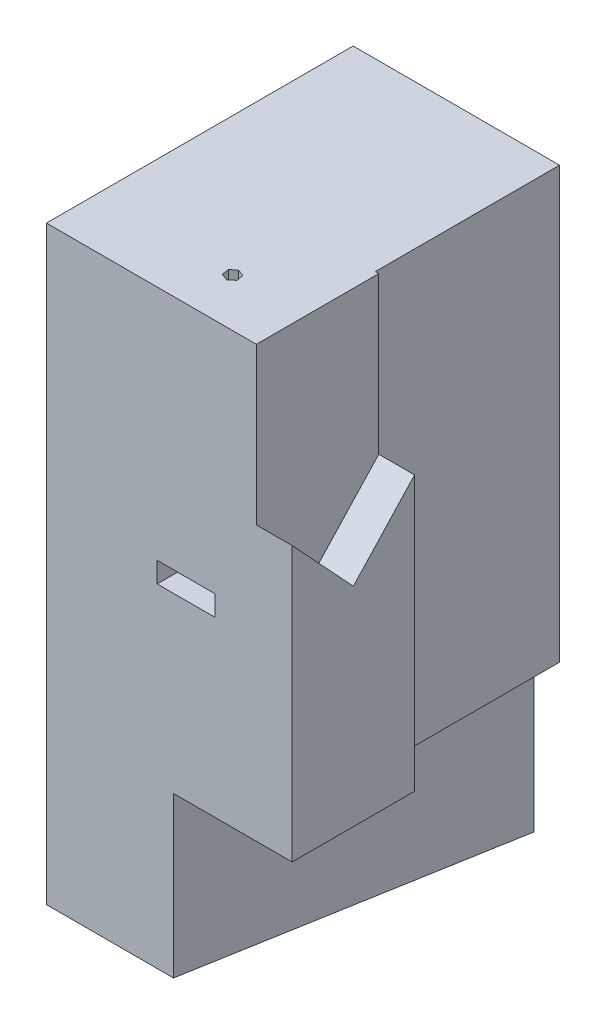
ISO-10303-21;
HEADER;
FILE_DESCRIPTION(('STEP AP214'),'2;1');
FILE_NAME('part.step','',(''),(''),'','','');
FILE_SCHEMA(('AUTOMOTIVE_DESIGN { 1 0 10303 214 1 1 1 1 }'));
ENDSEC;
DATA;
#1=APPLICATION_CONTEXT('core data for automotive mechanical design processes');
#2=APPLICATION_PROTOCOL_DEFINITION('international standard','automotive_design',2000,#1);
#3=PRODUCT_CONTEXT('',#1,'mechanical');
#4=PRODUCT('Part','Part','',(#3));
#5=PRODUCT_RELATED_PRODUCT_CATEGORY('part','',(#4));
#6=PRODUCT_DEFINITION_FORMATION('','',#4);
#7=PRODUCT_DEFINITION_CONTEXT('part definition',#1,'design');
#8=PRODUCT_DEFINITION('design','',#6,#7);
#9=PRODUCT_DEFINITION_SHAPE('','',#8);
#10=(LENGTH_UNIT() NAMED_UNIT(*) SI_UNIT(.MILLI.,.METRE.));
#11=(NAMED_UNIT(*) PLANE_ANGLE_UNIT() SI_UNIT($,.RADIAN.));
#12=(NAMED_UNIT(*) SI_UNIT($,.STERADIAN.) SOLID_ANGLE_UNIT());
#13=UNCERTAINTY_MEASURE_WITH_UNIT(LENGTH_MEASURE(1.E-05),#10,'distance_accuracy_value','');
#14=(GEOMETRIC_REPRESENTATION_CONTEXT(3) GLOBAL_UNCERTAINTY_ASSIGNED_CONTEXT((#13)) GLOBAL_UNIT_ASSIGNED_CONTEXT((#10,
#11,#12)) REPRESENTATION_CONTEXT('',''));
#15=CARTESIAN_POINT('',(0.,0.,0.));
#16=DIRECTION('',(0.,0.,1.));
#17=DIRECTION('',(1.,0.,0.));
#18=AXIS2_PLACEMENT_3D('',#15,#16,#17);
#19=CARTESIAN_POINT('',(0.,0.,0.));
#20=DIRECTION('',(1.,0.,0.));
#21=DIRECTION('',(0.,1.,0.));
#22=AXIS2_PLACEMENT_3D('',#19,#20,#21);
#23=PLANE('',#22);
#24=DIRECTION('',(0.,1.,0.));
#25=VECTOR('',#24,1.);
#26=CARTESIAN_POINT('',(0.,0.,42.183824742807));
#27=LINE('',#26,#25);
#28=CARTESIAN_POINT('',(0.,0.,42.183824742807));
#29=VERTEX_POINT('',#28);
#30=CARTESIAN_POINT('',(0.,81.175967861416,42.183824742807));
#31=VERTEX_POINT('',#30);
#32=EDGE_CURVE('E46',#29,#31,#27,.T.);
#33=ORIENTED_EDGE('',*,*,#32,.T.);
#34=DIRECTION('',(0.,0.,1.));
#35=VECTOR('',#34,1.);
#36=CARTESIAN_POINT('',(0.,81.175967861416,0.));
#37=LINE('',#36,#35);
#38=CARTESIAN_POINT('',(0.,81.175967861416,0.));
#39=VERTEX_POINT('',#38);
#40=EDGE_CURVE('E197',#39,#31,#37,.T.);
#41=ORIENTED_EDGE('',*,*,#40,.F.);
#42=DIRECTION('',(0.,1.,0.));
#43=VECTOR('',#42,1.);
#44=CARTESIAN_POINT('',(0.,0.,0.));
#45=LINE('',#44,#43);
#46=CARTESIAN_POINT('',(0.,0.,0.));
#47=VERTEX_POINT('',#46);
#48=EDGE_CURVE('E195',#47,#39,#45,.T.);
#49=ORIENTED_EDGE('',*,*,#48,.F.);
#50=DIRECTION('',(0.,0.,1.));
#51=VECTOR('',#50,1.);
#52=CARTESIAN_POINT('',(0.,0.,0.));
#53=LINE('',#52,#51);
#54=EDGE_CURVE('E10',#47,#29,#53,.T.);
#55=ORIENTED_EDGE('',*,*,#54,.T.);
#56=EDGE_LOOP('',(#33,#41,#49,#55));
#57=FACE_BOUND('',#56,.T.);
#58=ADVANCED_FACE('F16',(#57),#23,.F.);
#59=CARTESIAN_POINT('',(0.,0.,0.));
#60=DIRECTION('',(0.,1.,0.));
#61=DIRECTION('',(1.,0.,0.));
#62=AXIS2_PLACEMENT_3D('',#59,#60,#61);
#63=PLANE('',#62);
#64=DIRECTION('',(0.172664554892018,0.,-0.984980685843099));
#65=VECTOR('',#64,1.);
#66=CARTESIAN_POINT('',(17.477008117361,0.,42.183824742807));
#67=LINE('',#66,#65);
#68=CARTESIAN_POINT('',(17.477008117361,0.,42.183824742807));
#69=VERTEX_POINT('',#68);
#70=CARTESIAN_POINT('',(24.871722985947,0.,0.));
#71=VERTEX_POINT('',#70);
#72=EDGE_CURVE('E217',#69,#71,#67,.T.);
#73=ORIENTED_EDGE('',*,*,#72,.F.);
#74=DIRECTION('',(1.,0.,0.));
#75=VECTOR('',#74,1.);
#76=CARTESIAN_POINT('',(0.,0.,42.183824742807));
#77=LINE('',#76,#75);
#78=EDGE_CURVE('E24',#29,#69,#77,.T.);
#79=ORIENTED_EDGE('',*,*,#78,.F.);
#80=ORIENTED_EDGE('',*,*,#54,.F.);
#81=DIRECTION('',(1.,0.,0.));
#82=VECTOR('',#81,1.);
#83=CARTESIAN_POINT('',(0.,0.,0.));
#84=LINE('',#83,#82);
#85=EDGE_CURVE('E192',#47,#71,#84,.T.);
#86=ORIENTED_EDGE('',*,*,#85,.T.);
#87=EDGE_LOOP('',(#73,#79,#80,#86));
#88=FACE_BOUND('',#87,.T.);
#89=ADVANCED_FACE('F190',(#88),#63,.F.);
#90=CARTESIAN_POINT('',(0.,0.,42.183824742807));
#91=DIRECTION('',(0.,0.,1.));
#92=DIRECTION('',(1.,0.,0.));
#93=AXIS2_PLACEMENT_3D('',#90,#91,#92);
#94=PLANE('',#93);
#95=DIRECTION('',(0.,-1.,0.));
#96=VECTOR('',#95,1.);
#97=CARTESIAN_POINT('',(15.229602048804,48.619948858316,42.183824742807));
#98=LINE('',#97,#96);
#99=CARTESIAN_POINT('',(15.229602048804,48.619948858316,42.183824742807));
#100=VERTEX_POINT('',#99);
#101=CARTESIAN_POINT('',(15.229602048804,45.812590166775,42.183824742807));
#102=VERTEX_POINT('',#101);
#103=EDGE_CURVE('E284',#100,#102,#98,.T.);
#104=ORIENTED_EDGE('',*,*,#103,.F.);
#105=DIRECTION('',(-1.,0.,0.));
#106=VECTOR('',#105,1.);
#107=CARTESIAN_POINT('',(23.152847127791,48.619948858316,42.183824742807));
#108=LINE('',#107,#106);
#109=CARTESIAN_POINT('',(23.152847127791,48.619948858316,42.183824742807));
#110=VERTEX_POINT('',#109);
#111=EDGE_CURVE('E307',#110,#100,#108,.T.);
#112=ORIENTED_EDGE('',*,*,#111,.F.);
#113=DIRECTION('',(0.,1.,0.));
#114=VECTOR('',#113,1.);
#115=CARTESIAN_POINT('',(23.152847127791,45.812590166775,42.183824742807));
#116=LINE('',#115,#114);
#117=CARTESIAN_POINT('',(23.152847127791,45.812590166775,42.183824742807));
#118=VERTEX_POINT('',#117);
#119=EDGE_CURVE('E297',#118,#110,#116,.T.);
#120=ORIENTED_EDGE('',*,*,#119,.F.);
#121=DIRECTION('',(1.,0.,0.));
#122=VECTOR('',#121,1.);
#123=CARTESIAN_POINT('',(15.229602048804,45.812590166775,42.183824742807));
#124=LINE('',#123,#122);
#125=EDGE_CURVE('E290',#102,#118,#124,.T.);
#126=ORIENTED_EDGE('',*,*,#125,.F.);
#127=EDGE_LOOP('',(#104,#112,#120,#126));
#128=FACE_BOUND('',#127,.T.);
#129=DIRECTION('',(1.,0.,0.));
#130=VECTOR('',#129,1.);
#131=CARTESIAN_POINT('',(0.,81.175967861416,42.183824742807));
#132=LINE('',#131,#130);
#133=CARTESIAN_POINT('',(28.871427412026,81.175967861416,42.183824742807));
#134=VERTEX_POINT('',#133);
#135=EDGE_CURVE('E224',#31,#134,#132,.T.);
#136=ORIENTED_EDGE('',*,*,#135,.F.);
#137=ORIENTED_EDGE('',*,*,#32,.F.);
#138=ORIENTED_EDGE('',*,*,#78,.T.);
#139=DIRECTION('',(0.,1.,0.));
#140=VECTOR('',#139,1.);
#141=CARTESIAN_POINT('',(17.477008117361,0.,42.183824742807));
#142=LINE('',#141,#140);
#143=CARTESIAN_POINT('',(17.477008117361,21.978345845395,42.183824742807));
#144=VERTEX_POINT('',#143);
#145=EDGE_CURVE('E209',#69,#144,#142,.T.);
#146=ORIENTED_EDGE('',*,*,#145,.T.);
#147=DIRECTION('',(-1.,0.,0.));
#148=VECTOR('',#147,1.);
#149=CARTESIAN_POINT('',(33.795977035529,21.978345845395,42.183824742807));
#150=LINE('',#149,#148);
#151=CARTESIAN_POINT('',(33.795977035529,21.978345845395,42.183824742807));
#152=VERTEX_POINT('',#151);
#153=EDGE_CURVE('E272',#152,#144,#150,.T.);
#154=ORIENTED_EDGE('',*,*,#153,.F.);
#155=DIRECTION('',(0.,1.,0.));
#156=VECTOR('',#155,1.);
#157=CARTESIAN_POINT('',(33.795977035529,0.,42.183824742807));
#158=LINE('',#157,#156);
#159=CARTESIAN_POINT('',(33.795977035529,59.664036571161,42.183824742807));
#160=VERTEX_POINT('',#159);
#161=EDGE_CURVE('E264',#152,#160,#158,.T.);
#162=ORIENTED_EDGE('',*,*,#161,.T.);
#163=DIRECTION('',(-1.,0.,0.));
#164=VECTOR('',#163,1.);
#165=CARTESIAN_POINT('',(33.795977035529,59.664036571161,42.183824742807));
#166=LINE('',#165,#164);
#167=CARTESIAN_POINT('',(28.871427412026,59.664036571161,42.183824742807));
#168=VERTEX_POINT('',#167);
#169=EDGE_CURVE('E256',#160,#168,#166,.T.);
#170=ORIENTED_EDGE('',*,*,#169,.T.);
#171=DIRECTION('',(0.,-1.,0.));
#172=VECTOR('',#171,1.);
#173=CARTESIAN_POINT('',(28.871427412026,81.175967861416,42.183824742807));
#174=LINE('',#173,#172);
#175=EDGE_CURVE('E242',#134,#168,#174,.T.);
#176=ORIENTED_EDGE('',*,*,#175,.F.);
#177=EDGE_LOOP('',(#136,#137,#138,#146,#154,#162,#170,#176));
#178=FACE_BOUND('',#177,.T.);
#179=ADVANCED_FACE('F233',(#128,#178),#94,.T.);
#180=CARTESIAN_POINT('',(0.,81.175967861416,0.));
#181=DIRECTION('',(0.,1.,0.));
#182=DIRECTION('',(1.,0.,0.));
#183=AXIS2_PLACEMENT_3D('',#180,#181,#182);
#184=PLANE('',#183);
#185=DIRECTION('',(0.773795954502681,0.,-0.633434938091739));
#186=VECTOR('',#185,1.);
#187=CARTESIAN_POINT('',(19.135894746739,81.175967861416,36.54601650734));
#188=LINE('',#187,#186);
#189=CARTESIAN_POINT('',(19.135894746739,81.175967861416,36.54601650734));
#190=VERTEX_POINT('',#189);
#191=CARTESIAN_POINT('',(19.909690701242,81.175967861416,35.912581569248));
#192=VERTEX_POINT('',#191);
#193=EDGE_CURVE('E351',#190,#192,#188,.T.);
#194=ORIENTED_EDGE('',*,*,#193,.F.);
#195=DIRECTION('',(0.935468725283385,0.,0.353409484899145));
#196=VECTOR('',#195,1.);
#197=CARTESIAN_POINT('',(18.200426021455,81.175967861416,36.19260702244));
#198=LINE('',#197,#196);
#199=CARTESIAN_POINT('',(18.200426021455,81.175967861416,36.19260702244));
#200=VERTEX_POINT('',#199);
#201=EDGE_CURVE('E380',#200,#190,#198,.T.);
#202=ORIENTED_EDGE('',*,*,#201,.F.);
#203=DIRECTION('',(0.161672770780964,0.,0.98684442299078));
#204=VECTOR('',#203,1.);
#205=CARTESIAN_POINT('',(18.038753250675,81.175967861416,35.205762599449));
#206=LINE('',#205,#204);
#207=CARTESIAN_POINT('',(18.038753250675,81.175967861416,35.205762599449));
#208=VERTEX_POINT('',#207);
#209=EDGE_CURVE('E371',#208,#200,#206,.T.);
#210=ORIENTED_EDGE('',*,*,#209,.F.);
#211=DIRECTION('',(-0.773795954502681,0.,0.633434938091739));
#212=VECTOR('',#211,1.);
#213=CARTESIAN_POINT('',(18.812549205178,81.175967861416,34.572327661358));
#214=LINE('',#213,#212);
#215=CARTESIAN_POINT('',(18.812549205178,81.175967861416,34.572327661358));
#216=VERTEX_POINT('',#215);
#217=EDGE_CURVE('E365',#216,#208,#214,.T.);
#218=ORIENTED_EDGE('',*,*,#217,.F.);
#219=DIRECTION('',(-0.935468725283385,0.,-0.353409484899145));
#220=VECTOR('',#219,1.);
#221=CARTESIAN_POINT('',(19.748017930461,81.175967861416,34.925737146257));
#222=LINE('',#221,#220);
#223=CARTESIAN_POINT('',(19.748017930461,81.175967861416,34.925737146257));
#224=VERTEX_POINT('',#223);
#225=EDGE_CURVE('E359',#224,#216,#222,.T.);
#226=ORIENTED_EDGE('',*,*,#225,.F.);
#227=DIRECTION('',(-0.161672770780964,0.,-0.98684442299078));
#228=VECTOR('',#227,1.);
#229=CARTESIAN_POINT('',(19.909690701242,81.175967861416,35.912581569248));
#230=LINE('',#229,#228);
#231=EDGE_CURVE('E355',#192,#224,#230,.T.);
#232=ORIENTED_EDGE('',*,*,#231,.F.);
#233=EDGE_LOOP('',(#194,#202,#210,#218,#226,#232));
#234=FACE_BOUND('',#233,.T.);
#235=DIRECTION('',(1.,0.,0.));
#236=VECTOR('',#235,1.);
#237=CARTESIAN_POINT('',(0.,81.175967861416,0.));
#238=LINE('',#237,#236);
#239=CARTESIAN_POINT('',(28.391305665756,81.175967861416,0.));
#240=VERTEX_POINT('',#239);
#241=EDGE_CURVE('E201',#39,#240,#238,.T.);
#242=ORIENTED_EDGE('',*,*,#241,.F.);
#243=ORIENTED_EDGE('',*,*,#40,.T.);
#244=ORIENTED_EDGE('',*,*,#135,.T.);
#245=DIRECTION('',(0.,0.,1.));
#246=VECTOR('',#245,1.);
#247=CARTESIAN_POINT('',(28.871427412026,81.175967861416,25.350509369454));
#248=LINE('',#247,#246);
#249=CARTESIAN_POINT('',(28.871427412026,81.175967861416,25.350509369454));
#250=VERTEX_POINT('',#249);
#251=EDGE_CURVE('E248',#250,#134,#248,.T.);
#252=ORIENTED_EDGE('',*,*,#251,.F.);
#253=DIRECTION('',(-1.,0.,0.));
#254=VECTOR('',#253,1.);
#255=CARTESIAN_POINT('',(33.795977035529,81.175967861416,25.350509369454));
#256=LINE('',#255,#254);
#257=CARTESIAN_POINT('',(28.391305665756,81.175967861416,25.350509369454));
#258=VERTEX_POINT('',#257);
#259=EDGE_CURVE('E335',#250,#258,#256,.T.);
#260=ORIENTED_EDGE('',*,*,#259,.T.);
#261=DIRECTION('',(0.,0.,1.));
#262=VECTOR('',#261,1.);
#263=CARTESIAN_POINT('',(28.391305665756,81.175967861416,0.));
#264=LINE('',#263,#262);
#265=EDGE_CURVE('E320',#240,#258,#264,.T.);
#266=ORIENTED_EDGE('',*,*,#265,.F.);
#267=EDGE_LOOP('',(#242,#243,#244,#252,#260,#266));
#268=FACE_BOUND('',#267,.T.);
#269=ADVANCED_FACE('F493',(#234,#268),#184,.T.);
#270=CARTESIAN_POINT('',(0.,0.,0.));
#271=DIRECTION('',(0.,0.,1.));
#272=DIRECTION('',(1.,0.,0.));
#273=AXIS2_PLACEMENT_3D('',#270,#271,#272);
#274=PLANE('',#273);
#275=DIRECTION('',(1.,0.,0.));
#276=VECTOR('',#275,1.);
#277=CARTESIAN_POINT('',(7.614801024402,45.812590166775,0.));
#278=LINE('',#277,#276);
#279=CARTESIAN_POINT('',(15.229602048804,45.812590166775,0.));
#280=VERTEX_POINT('',#279);
#281=CARTESIAN_POINT('',(23.152847127791,45.812590166775,0.));
#282=VERTEX_POINT('',#281);
#283=EDGE_CURVE('E294',#280,#282,#278,.T.);
#284=ORIENTED_EDGE('',*,*,#283,.T.);
#285=DIRECTION('',(0.,1.,0.));
#286=VECTOR('',#285,1.);
#287=CARTESIAN_POINT('',(23.152847127791,22.906295083388,0.));
#288=LINE('',#287,#286);
#289=CARTESIAN_POINT('',(23.152847127791,48.619948858316,0.));
#290=VERTEX_POINT('',#289);
#291=EDGE_CURVE('E304',#282,#290,#288,.T.);
#292=ORIENTED_EDGE('',*,*,#291,.T.);
#293=DIRECTION('',(-1.,0.,0.));
#294=VECTOR('',#293,1.);
#295=CARTESIAN_POINT('',(11.576423563895,48.619948858316,0.));
#296=LINE('',#295,#294);
#297=CARTESIAN_POINT('',(15.229602048804,48.619948858316,0.));
#298=VERTEX_POINT('',#297);
#299=EDGE_CURVE('E312',#290,#298,#296,.T.);
#300=ORIENTED_EDGE('',*,*,#299,.T.);
#301=DIRECTION('',(0.,-1.,0.));
#302=VECTOR('',#301,1.);
#303=CARTESIAN_POINT('',(15.229602048804,24.309974429158,0.));
#304=LINE('',#303,#302);
#305=EDGE_CURVE('E287',#298,#280,#304,.T.);
#306=ORIENTED_EDGE('',*,*,#305,.T.);
#307=EDGE_LOOP('',(#284,#292,#300,#306));
#308=FACE_BOUND('',#307,.T.);
#309=DIRECTION('',(0.,1.,0.));
#310=VECTOR('',#309,1.);
#311=CARTESIAN_POINT('',(28.391305665756,21.978345845395,0.));
#312=LINE('',#311,#310);
#313=CARTESIAN_POINT('',(28.391305665756,21.978345845395,0.));
#314=VERTEX_POINT('',#313);
#315=EDGE_CURVE('E323',#314,#240,#312,.T.);
#316=ORIENTED_EDGE('',*,*,#315,.F.);
#317=DIRECTION('',(1.,0.,0.));
#318=VECTOR('',#317,1.);
#319=CARTESIAN_POINT('',(24.871722985947,21.978345845395,0.));
#320=LINE('',#319,#318);
#321=CARTESIAN_POINT('',(24.871722985947,21.978345845395,0.));
#322=VERTEX_POINT('',#321);
#323=EDGE_CURVE('E279',#322,#314,#320,.T.);
#324=ORIENTED_EDGE('',*,*,#323,.F.);
#325=DIRECTION('',(0.,1.,0.));
#326=VECTOR('',#325,1.);
#327=CARTESIAN_POINT('',(24.871722985947,0.,0.));
#328=LINE('',#327,#326);
#329=EDGE_CURVE('E206',#71,#322,#328,.T.);
#330=ORIENTED_EDGE('',*,*,#329,.F.);
#331=ORIENTED_EDGE('',*,*,#85,.F.);
#332=ORIENTED_EDGE('',*,*,#48,.T.);
#333=ORIENTED_EDGE('',*,*,#241,.T.);
#334=EDGE_LOOP('',(#316,#324,#330,#331,#332,#333));
#335=FACE_BOUND('',#334,.T.);
#336=ADVANCED_FACE('F204',(#308,#335),#274,.F.);
#337=CARTESIAN_POINT('',(17.477008117361,0.,42.183824742807));
#338=DIRECTION('',(-0.984980685843099,0.,-0.172664554892018));
#339=DIRECTION('',(-0.172664554892018,0.,0.984980685843099));
#340=AXIS2_PLACEMENT_3D('',#337,#338,#339);
#341=PLANE('',#340);
#342=ORIENTED_EDGE('',*,*,#72,.T.);
#343=ORIENTED_EDGE('',*,*,#329,.T.);
#344=DIRECTION('',(0.172664554892018,0.,-0.984980685843099));
#345=VECTOR('',#344,1.);
#346=CARTESIAN_POINT('',(17.477008117361,21.978345845395,42.183824742807));
#347=LINE('',#346,#345);
#348=EDGE_CURVE('E240',#144,#322,#347,.T.);
#349=ORIENTED_EDGE('',*,*,#348,.F.);
#350=ORIENTED_EDGE('',*,*,#145,.F.);
#351=EDGE_LOOP('',(#342,#343,#349,#350));
#352=FACE_BOUND('',#351,.T.);
#353=ADVANCED_FACE('F238',(#352),#341,.F.);
#354=CARTESIAN_POINT('',(28.871427412026,68.092819998844,33.767167056131));
#355=DIRECTION('',(1.,0.,0.));
#356=DIRECTION('',(0.,-1.,0.));
#357=AXIS2_PLACEMENT_3D('',#354,#355,#356);
#358=PLANE('',#357);
#359=DIRECTION('',(0.,1.,0.));
#360=VECTOR('',#359,1.);
#361=CARTESIAN_POINT('',(28.871427412026,59.664036571161,25.350509369454));
#362=LINE('',#361,#360);
#363=CARTESIAN_POINT('',(28.871427412026,59.664036571161,25.350509369454));
#364=VERTEX_POINT('',#363);
#365=EDGE_CURVE('E331',#364,#250,#362,.T.);
#366=ORIENTED_EDGE('',*,*,#365,.T.);
#367=ORIENTED_EDGE('',*,*,#251,.T.);
#368=ORIENTED_EDGE('',*,*,#175,.T.);
#369=DIRECTION('',(0.,-0.732466224419216,-0.680803371088201));
#370=VECTOR('',#369,1.);
#371=CARTESIAN_POINT('',(28.871427412026,59.664036571161,42.183824742807));
#372=LINE('',#371,#370);
#373=CARTESIAN_POINT('',(28.871427412026,50.608679709255,33.767167056131));
#374=VERTEX_POINT('',#373);
#375=EDGE_CURVE('E261',#168,#374,#372,.T.);
#376=ORIENTED_EDGE('',*,*,#375,.T.);
#377=DIRECTION('',(0.,0.732466224419216,-0.680803371088201));
#378=VECTOR('',#377,1.);
#379=CARTESIAN_POINT('',(28.871427412026,50.608679709255,33.767167056131));
#380=LINE('',#379,#378);
#381=EDGE_CURVE('E406',#374,#364,#380,.T.);
#382=ORIENTED_EDGE('',*,*,#381,.T.);
#383=EDGE_LOOP('',(#366,#367,#368,#376,#382));
#384=FACE_BOUND('',#383,.T.);
#385=ADVANCED_FACE('F723',(#384),#358,.T.);
#386=CARTESIAN_POINT('',(33.795977035529,59.664036571161,42.183824742807));
#387=DIRECTION('',(0.,-0.680803371088201,0.732466224419216));
#388=DIRECTION('',(-1.,0.,0.));
#389=AXIS2_PLACEMENT_3D('',#386,#387,#388);
#390=PLANE('',#389);
#391=DIRECTION('',(0.,-0.732466224419216,-0.680803371088201));
#392=VECTOR('',#391,1.);
#393=CARTESIAN_POINT('',(33.795977035529,59.664036571161,42.183824742807));
#394=LINE('',#393,#392);
#395=CARTESIAN_POINT('',(33.795977035529,50.608679709255,33.767167056131));
#396=VERTEX_POINT('',#395);
#397=EDGE_CURVE('E268',#160,#396,#394,.T.);
#398=ORIENTED_EDGE('',*,*,#397,.T.);
#399=DIRECTION('',(-1.,0.,0.));
#400=VECTOR('',#399,1.);
#401=CARTESIAN_POINT('',(33.795977035529,50.608679709255,33.767167056131));
#402=LINE('',#401,#400);
#403=EDGE_CURVE('E386',#396,#374,#402,.T.);
#404=ORIENTED_EDGE('',*,*,#403,.T.);
#405=ORIENTED_EDGE('',*,*,#375,.F.);
#406=ORIENTED_EDGE('',*,*,#169,.F.);
#407=EDGE_LOOP('',(#398,#404,#405,#406));
#408=FACE_BOUND('',#407,.T.);
#409=ADVANCED_FACE('F733',(#408),#390,.F.);
#410=CARTESIAN_POINT('',(33.795977035529,0.,0.));
#411=DIRECTION('',(1.,0.,0.));
#412=DIRECTION('',(0.,1.,0.));
#413=AXIS2_PLACEMENT_3D('',#410,#411,#412);
#414=PLANE('',#413);
#415=DIRECTION('',(0.,0.,1.));
#416=VECTOR('',#415,1.);
#417=CARTESIAN_POINT('',(33.795977035529,21.978345845395,0.));
#418=LINE('',#417,#416);
#419=CARTESIAN_POINT('',(33.795977035529,21.978345845395,25.350509369454));
#420=VERTEX_POINT('',#419);
#421=EDGE_CURVE('E275',#420,#152,#418,.T.);
#422=ORIENTED_EDGE('',*,*,#421,.F.);
#423=DIRECTION('',(0.,-1.,0.));
#424=VECTOR('',#423,1.);
#425=CARTESIAN_POINT('',(33.795977035529,81.175967861416,25.350509369454));
#426=LINE('',#425,#424);
#427=CARTESIAN_POINT('',(33.795977035529,59.664036571161,25.350509369454));
#428=VERTEX_POINT('',#427);
#429=EDGE_CURVE('E347',#428,#420,#426,.T.);
#430=ORIENTED_EDGE('',*,*,#429,.F.);
#431=DIRECTION('',(0.,0.732466224419216,-0.680803371088201));
#432=VECTOR('',#431,1.);
#433=CARTESIAN_POINT('',(33.795977035529,50.608679709255,33.767167056131));
#434=LINE('',#433,#432);
#435=EDGE_CURVE('E388',#396,#428,#434,.T.);
#436=ORIENTED_EDGE('',*,*,#435,.F.);
#437=ORIENTED_EDGE('',*,*,#397,.F.);
#438=ORIENTED_EDGE('',*,*,#161,.F.);
#439=EDGE_LOOP('',(#422,#430,#436,#437,#438));
#440=FACE_BOUND('',#439,.T.);
#441=ADVANCED_FACE('F743',(#440),#414,.T.);
#442=CARTESIAN_POINT('',(27.324363034795,21.978345845395,22.506541580254));
#443=DIRECTION('',(0.,-1.,0.));
#444=DIRECTION('',(0.,0.,-1.));
#445=AXIS2_PLACEMENT_3D('',#442,#443,#444);
#446=PLANE('',#445);
#447=ORIENTED_EDGE('',*,*,#348,.T.);
#448=ORIENTED_EDGE('',*,*,#323,.T.);
#449=DIRECTION('',(0.,0.,-1.));
#450=VECTOR('',#449,1.);
#451=CARTESIAN_POINT('',(28.391305665756,21.978345845395,25.350509369454));
#452=LINE('',#451,#450);
#453=CARTESIAN_POINT('',(28.391305665756,21.978345845395,25.350509369454));
#454=VERTEX_POINT('',#453);
#455=EDGE_CURVE('E330',#454,#314,#452,.T.);
#456=ORIENTED_EDGE('',*,*,#455,.F.);
#457=DIRECTION('',(-1.,0.,0.));
#458=VECTOR('',#457,1.);
#459=CARTESIAN_POINT('',(33.795977035529,21.978345845395,25.350509369454));
#460=LINE('',#459,#458);
#461=EDGE_CURVE('E343',#420,#454,#460,.T.);
#462=ORIENTED_EDGE('',*,*,#461,.F.);
#463=ORIENTED_EDGE('',*,*,#421,.T.);
#464=ORIENTED_EDGE('',*,*,#153,.T.);
#465=EDGE_LOOP('',(#447,#448,#456,#462,#463,#464));
#466=FACE_BOUND('',#465,.T.);
#467=ADVANCED_FACE('F754',(#466),#446,.T.);
#468=CARTESIAN_POINT('',(15.229602048804,48.619948858316,42.183824742807));
#469=DIRECTION('',(-1.,0.,0.));
#470=DIRECTION('',(0.,0.,1.));
#471=AXIS2_PLACEMENT_3D('',#468,#469,#470);
#472=PLANE('',#471);
#473=DIRECTION('',(0.,0.,-1.));
#474=VECTOR('',#473,1.);
#475=CARTESIAN_POINT('',(15.229602048804,45.812590166775,42.183824742807));
#476=LINE('',#475,#474);
#477=EDGE_CURVE('E293',#102,#280,#476,.T.);
#478=ORIENTED_EDGE('',*,*,#477,.T.);
#479=ORIENTED_EDGE('',*,*,#305,.F.);
#480=DIRECTION('',(0.,0.,-1.));
#481=VECTOR('',#480,1.);
#482=CARTESIAN_POINT('',(15.229602048804,48.619948858316,42.183824742807));
#483=LINE('',#482,#481);
#484=EDGE_CURVE('E316',#100,#298,#483,.T.);
#485=ORIENTED_EDGE('',*,*,#484,.F.);
#486=ORIENTED_EDGE('',*,*,#103,.T.);
#487=EDGE_LOOP('',(#478,#479,#485,#486));
#488=FACE_BOUND('',#487,.T.);
#489=ADVANCED_FACE('F764',(#488),#472,.F.);
#490=CARTESIAN_POINT('',(15.229602048804,45.812590166775,42.183824742807));
#491=DIRECTION('',(0.,-1.,0.));
#492=DIRECTION('',(0.,0.,-1.));
#493=AXIS2_PLACEMENT_3D('',#490,#491,#492);
#494=PLANE('',#493);
#495=DIRECTION('',(0.,0.,-1.));
#496=VECTOR('',#495,1.);
#497=CARTESIAN_POINT('',(23.152847127791,45.812590166775,42.183824742807));
#498=LINE('',#497,#496);
#499=EDGE_CURVE('E300',#118,#282,#498,.T.);
#500=ORIENTED_EDGE('',*,*,#499,.T.);
#501=ORIENTED_EDGE('',*,*,#283,.F.);
#502=ORIENTED_EDGE('',*,*,#477,.F.);
#503=ORIENTED_EDGE('',*,*,#125,.T.);
#504=EDGE_LOOP('',(#500,#501,#502,#503));
#505=FACE_BOUND('',#504,.T.);
#506=ADVANCED_FACE('F777',(#505),#494,.F.);
#507=CARTESIAN_POINT('',(23.152847127791,45.812590166775,42.183824742807));
#508=DIRECTION('',(1.,0.,0.));
#509=DIRECTION('',(0.,1.,0.));
#510=AXIS2_PLACEMENT_3D('',#507,#508,#509);
#511=PLANE('',#510);
#512=DIRECTION('',(0.,0.,-1.));
#513=VECTOR('',#512,1.);
#514=CARTESIAN_POINT('',(23.152847127791,48.619948858316,42.183824742807));
#515=LINE('',#514,#513);
#516=EDGE_CURVE('E308',#110,#290,#515,.T.);
#517=ORIENTED_EDGE('',*,*,#516,.T.);
#518=ORIENTED_EDGE('',*,*,#291,.F.);
#519=ORIENTED_EDGE('',*,*,#499,.F.);
#520=ORIENTED_EDGE('',*,*,#119,.T.);
#521=EDGE_LOOP('',(#517,#518,#519,#520));
#522=FACE_BOUND('',#521,.T.);
#523=ADVANCED_FACE('F772',(#522),#511,.F.);
#524=CARTESIAN_POINT('',(23.152847127791,48.619948858316,42.183824742807));
#525=DIRECTION('',(0.,1.,0.));
#526=DIRECTION('',(1.,0.,0.));
#527=AXIS2_PLACEMENT_3D('',#524,#525,#526);
#528=PLANE('',#527);
#529=ORIENTED_EDGE('',*,*,#484,.T.);
#530=ORIENTED_EDGE('',*,*,#299,.F.);
#531=ORIENTED_EDGE('',*,*,#516,.F.);
#532=ORIENTED_EDGE('',*,*,#111,.T.);
#533=EDGE_LOOP('',(#529,#530,#531,#532));
#534=FACE_BOUND('',#533,.T.);
#535=ADVANCED_FACE('F776',(#534),#528,.F.);
#536=CARTESIAN_POINT('',(28.391305665756,51.577156853405,12.675254684727));
#537=DIRECTION('',(1.,0.,0.));
#538=DIRECTION('',(0.,1.,0.));
#539=AXIS2_PLACEMENT_3D('',#536,#537,#538);
#540=PLANE('',#539);
#541=ORIENTED_EDGE('',*,*,#455,.T.);
#542=ORIENTED_EDGE('',*,*,#315,.T.);
#543=ORIENTED_EDGE('',*,*,#265,.T.);
#544=DIRECTION('',(0.,-1.,0.));
#545=VECTOR('',#544,1.);
#546=CARTESIAN_POINT('',(28.391305665756,81.175967861416,25.350509369454));
#547=LINE('',#546,#545);
#548=EDGE_CURVE('E339',#258,#454,#547,.T.);
#549=ORIENTED_EDGE('',*,*,#548,.T.);
#550=EDGE_LOOP('',(#541,#542,#543,#549));
#551=FACE_BOUND('',#550,.T.);
#552=ADVANCED_FACE('F788',(#551),#540,.T.);
#553=CARTESIAN_POINT('',(33.795977035529,81.175967861416,25.350509369454));
#554=DIRECTION('',(0.,0.,1.));
#555=DIRECTION('',(1.,0.,0.));
#556=AXIS2_PLACEMENT_3D('',#553,#554,#555);
#557=PLANE('',#556);
#558=DIRECTION('',(-1.,0.,0.));
#559=VECTOR('',#558,1.);
#560=CARTESIAN_POINT('',(33.795977035529,59.664036571161,25.350509369454));
#561=LINE('',#560,#559);
#562=EDGE_CURVE('E392',#428,#364,#561,.T.);
#563=ORIENTED_EDGE('',*,*,#562,.F.);
#564=ORIENTED_EDGE('',*,*,#429,.T.);
#565=ORIENTED_EDGE('',*,*,#461,.T.);
#566=ORIENTED_EDGE('',*,*,#548,.F.);
#567=ORIENTED_EDGE('',*,*,#259,.F.);
#568=ORIENTED_EDGE('',*,*,#365,.F.);
#569=EDGE_LOOP('',(#563,#564,#565,#566,#567,#568));
#570=FACE_BOUND('',#569,.T.);
#571=ADVANCED_FACE('F445',(#570),#557,.F.);
#572=CARTESIAN_POINT('',(19.135894746739,81.175967861416,36.54601650734));
#573=DIRECTION('',(0.633434938091739,0.,0.773795954502681));
#574=DIRECTION('',(0.,-1.,0.));
#575=AXIS2_PLACEMENT_3D('',#572,#573,#574);
#576=PLANE('',#575);
#577=ORIENTED_EDGE('',*,*,#193,.T.);
#578=DIRECTION('',(0.,-1.,0.));
#579=VECTOR('',#578,1.);
#580=CARTESIAN_POINT('',(19.909690701242,81.175967861416,35.912581569248));
#581=LINE('',#580,#579);
#582=CARTESIAN_POINT('',(19.909690701242,62.99791827209,35.912581569248));
#583=VERTEX_POINT('',#582);
#584=EDGE_CURVE('E352',#192,#583,#581,.T.);
#585=ORIENTED_EDGE('',*,*,#584,.T.);
#586=DIRECTION('',(0.773795954502681,0.,-0.633434938091739));
#587=VECTOR('',#586,1.);
#588=CARTESIAN_POINT('',(19.135894746739,62.99791827209,36.54601650734));
#589=LINE('',#588,#587);
#590=CARTESIAN_POINT('',(19.135894746739,62.99791827209,36.54601650734));
#591=VERTEX_POINT('',#590);
#592=EDGE_CURVE('E422',#591,#583,#589,.T.);
#593=ORIENTED_EDGE('',*,*,#592,.F.);
#594=DIRECTION('',(0.,-1.,0.));
#595=VECTOR('',#594,1.);
#596=CARTESIAN_POINT('',(19.135894746739,81.175967861416,36.54601650734));
#597=LINE('',#596,#595);
#598=EDGE_CURVE('E376',#190,#591,#597,.T.);
#599=ORIENTED_EDGE('',*,*,#598,.F.);
#600=EDGE_LOOP('',(#577,#585,#593,#599));
#601=FACE_BOUND('',#600,.T.);
#602=ADVANCED_FACE('F472',(#601),#576,.F.);
#603=CARTESIAN_POINT('',(19.909690701242,81.175967861416,35.912581569248));
#604=DIRECTION('',(0.98684442299078,0.,-0.161672770780964));
#605=DIRECTION('',(0.,-1.,0.));
#606=AXIS2_PLACEMENT_3D('',#603,#604,#605);
#607=PLANE('',#606);
#608=ORIENTED_EDGE('',*,*,#231,.T.);
#609=DIRECTION('',(0.,-1.,0.));
#610=VECTOR('',#609,1.);
#611=CARTESIAN_POINT('',(19.748017930461,81.175967861416,34.925737146257));
#612=LINE('',#611,#610);
#613=CARTESIAN_POINT('',(19.748017930461,62.99791827209,34.925737146257));
#614=VERTEX_POINT('',#613);
#615=EDGE_CURVE('E356',#224,#614,#612,.T.);
#616=ORIENTED_EDGE('',*,*,#615,.T.);
#617=DIRECTION('',(-0.161672770780964,0.,-0.98684442299078));
#618=VECTOR('',#617,1.);
#619=CARTESIAN_POINT('',(19.909690701242,62.99791827209,35.912581569248));
#620=LINE('',#619,#618);
#621=EDGE_CURVE('E412',#583,#614,#620,.T.);
#622=ORIENTED_EDGE('',*,*,#621,.F.);
#623=ORIENTED_EDGE('',*,*,#584,.F.);
#624=EDGE_LOOP('',(#608,#616,#622,#623));
#625=FACE_BOUND('',#624,.T.);
#626=ADVANCED_FACE('F477',(#625),#607,.F.);
#627=CARTESIAN_POINT('',(19.748017930461,81.175967861416,34.925737146257));
#628=DIRECTION('',(0.353409484899145,0.,-0.935468725283385));
#629=DIRECTION('',(0.,-1.,0.));
#630=AXIS2_PLACEMENT_3D('',#627,#628,#629);
#631=PLANE('',#630);
#632=ORIENTED_EDGE('',*,*,#225,.T.);
#633=DIRECTION('',(0.,-1.,0.));
#634=VECTOR('',#633,1.);
#635=CARTESIAN_POINT('',(18.812549205178,81.175967861416,34.572327661358));
#636=LINE('',#635,#634);
#637=CARTESIAN_POINT('',(18.812549205178,62.99791827209,34.572327661358));
#638=VERTEX_POINT('',#637);
#639=EDGE_CURVE('E362',#216,#638,#636,.T.);
#640=ORIENTED_EDGE('',*,*,#639,.T.);
#641=DIRECTION('',(-0.935468725283385,0.,-0.353409484899145));
#642=VECTOR('',#641,1.);
#643=CARTESIAN_POINT('',(19.748017930461,62.99791827209,34.925737146257));
#644=LINE('',#643,#642);
#645=EDGE_CURVE('E399',#614,#638,#644,.T.);
#646=ORIENTED_EDGE('',*,*,#645,.F.);
#647=ORIENTED_EDGE('',*,*,#615,.F.);
#648=EDGE_LOOP('',(#632,#640,#646,#647));
#649=FACE_BOUND('',#648,.T.);
#650=ADVANCED_FACE('F482',(#649),#631,.F.);
#651=CARTESIAN_POINT('',(18.812549205178,81.175967861416,34.572327661358));
#652=DIRECTION('',(-0.633434938091739,0.,-0.773795954502681));
#653=DIRECTION('',(-0.773795954502681,0.,0.633434938091739));
#654=AXIS2_PLACEMENT_3D('',#651,#652,#653);
#655=PLANE('',#654);
#656=ORIENTED_EDGE('',*,*,#217,.T.);
#657=DIRECTION('',(0.,-1.,0.));
#658=VECTOR('',#657,1.);
#659=CARTESIAN_POINT('',(18.038753250675,81.175967861416,35.205762599449));
#660=LINE('',#659,#658);
#661=CARTESIAN_POINT('',(18.038753250675,62.99791827209,35.205762599449));
#662=VERTEX_POINT('',#661);
#663=EDGE_CURVE('E369',#208,#662,#660,.T.);
#664=ORIENTED_EDGE('',*,*,#663,.T.);
#665=DIRECTION('',(-0.773795954502681,0.,0.633434938091739));
#666=VECTOR('',#665,1.);
#667=CARTESIAN_POINT('',(18.812549205178,62.99791827209,34.572327661358));
#668=LINE('',#667,#666);
#669=EDGE_CURVE('E394',#638,#662,#668,.T.);
#670=ORIENTED_EDGE('',*,*,#669,.F.);
#671=ORIENTED_EDGE('',*,*,#639,.F.);
#672=EDGE_LOOP('',(#656,#664,#670,#671));
#673=FACE_BOUND('',#672,.T.);
#674=ADVANCED_FACE('F487',(#673),#655,.F.);
#675=CARTESIAN_POINT('',(18.038753250675,81.175967861416,35.205762599449));
#676=DIRECTION('',(-0.98684442299078,0.,0.161672770780964));
#677=DIRECTION('',(0.,1.,0.));
#678=AXIS2_PLACEMENT_3D('',#675,#676,#677);
#679=PLANE('',#678);
#680=ORIENTED_EDGE('',*,*,#209,.T.);
#681=DIRECTION('',(0.,-1.,0.));
#682=VECTOR('',#681,1.);
#683=CARTESIAN_POINT('',(18.200426021455,81.175967861416,36.19260702244));
#684=LINE('',#683,#682);
#685=CARTESIAN_POINT('',(18.200426021455,62.99791827209,36.19260702244));
#686=VERTEX_POINT('',#685);
#687=EDGE_CURVE('E373',#200,#686,#684,.T.);
#688=ORIENTED_EDGE('',*,*,#687,.T.);
#689=DIRECTION('',(0.161672770780964,0.,0.98684442299078));
#690=VECTOR('',#689,1.);
#691=CARTESIAN_POINT('',(18.038753250675,62.99791827209,35.205762599449));
#692=LINE('',#691,#690);
#693=EDGE_CURVE('E398',#662,#686,#692,.T.);
#694=ORIENTED_EDGE('',*,*,#693,.F.);
#695=ORIENTED_EDGE('',*,*,#663,.F.);
#696=EDGE_LOOP('',(#680,#688,#694,#695));
#697=FACE_BOUND('',#696,.T.);
#698=ADVANCED_FACE('F491',(#697),#679,.F.);
#699=CARTESIAN_POINT('',(18.200426021455,81.175967861416,36.19260702244));
#700=DIRECTION('',(-0.353409484899145,0.,0.935468725283385));
#701=DIRECTION('',(0.,1.,0.));
#702=AXIS2_PLACEMENT_3D('',#699,#700,#701);
#703=PLANE('',#702);
#704=ORIENTED_EDGE('',*,*,#201,.T.);
#705=ORIENTED_EDGE('',*,*,#598,.T.);
#706=DIRECTION('',(0.935468725283385,0.,0.353409484899145));
#707=VECTOR('',#706,1.);
#708=CARTESIAN_POINT('',(18.200426021455,62.99791827209,36.19260702244));
#709=LINE('',#708,#707);
#710=EDGE_CURVE('E393',#686,#591,#709,.T.);
#711=ORIENTED_EDGE('',*,*,#710,.F.);
#712=ORIENTED_EDGE('',*,*,#687,.F.);
#713=EDGE_LOOP('',(#704,#705,#711,#712));
#714=FACE_BOUND('',#713,.T.);
#715=ADVANCED_FACE('F464',(#714),#703,.F.);
#716=CARTESIAN_POINT('',(33.795977035529,50.608679709255,33.767167056131));
#717=DIRECTION('',(0.,-0.680803371088201,-0.732466224419216));
#718=DIRECTION('',(0.,-0.732466224419216,0.680803371088201));
#719=AXIS2_PLACEMENT_3D('',#716,#717,#718);
#720=PLANE('',#719);
#721=ORIENTED_EDGE('',*,*,#435,.T.);
#722=ORIENTED_EDGE('',*,*,#562,.T.);
#723=ORIENTED_EDGE('',*,*,#381,.F.);
#724=ORIENTED_EDGE('',*,*,#403,.F.);
#725=EDGE_LOOP('',(#721,#722,#723,#724));
#726=FACE_BOUND('',#725,.T.);
#727=ADVANCED_FACE('F441',(#726),#720,.F.);
#728=CARTESIAN_POINT('',(18.974221975958,62.99791827209,35.559172084349));
#729=DIRECTION('',(0.,1.,0.));
#730=DIRECTION('',(1.,0.,0.));
#731=AXIS2_PLACEMENT_3D('',#728,#729,#730);
#732=PLANE('',#731);
#733=ORIENTED_EDGE('',*,*,#592,.T.);
#734=ORIENTED_EDGE('',*,*,#621,.T.);
#735=ORIENTED_EDGE('',*,*,#645,.T.);
#736=ORIENTED_EDGE('',*,*,#669,.T.);
#737=ORIENTED_EDGE('',*,*,#693,.T.);
#738=ORIENTED_EDGE('',*,*,#710,.T.);
#739=EDGE_LOOP('',(#733,#734,#735,#736,#737,#738));
#740=FACE_BOUND('',#739,.T.);
#741=ADVANCED_FACE('F470',(#740),#732,.T.);
#742=CLOSED_SHELL('',(#58,#89,#179,#269,#336,#353,#385,#409,#441,#467,#489,#506,#523,#535,#552,
#571,#602,#626,#650,#674,#698,#715,#727,#741));
#743=MANIFOLD_SOLID_BREP('B1',#742);
#744=ADVANCED_BREP_SHAPE_REPRESENTATION('',(#18,#743),#14);
#745=SHAPE_DEFINITION_REPRESENTATION(#9,#744);
ENDSEC;
END-ISO-10303-21;
